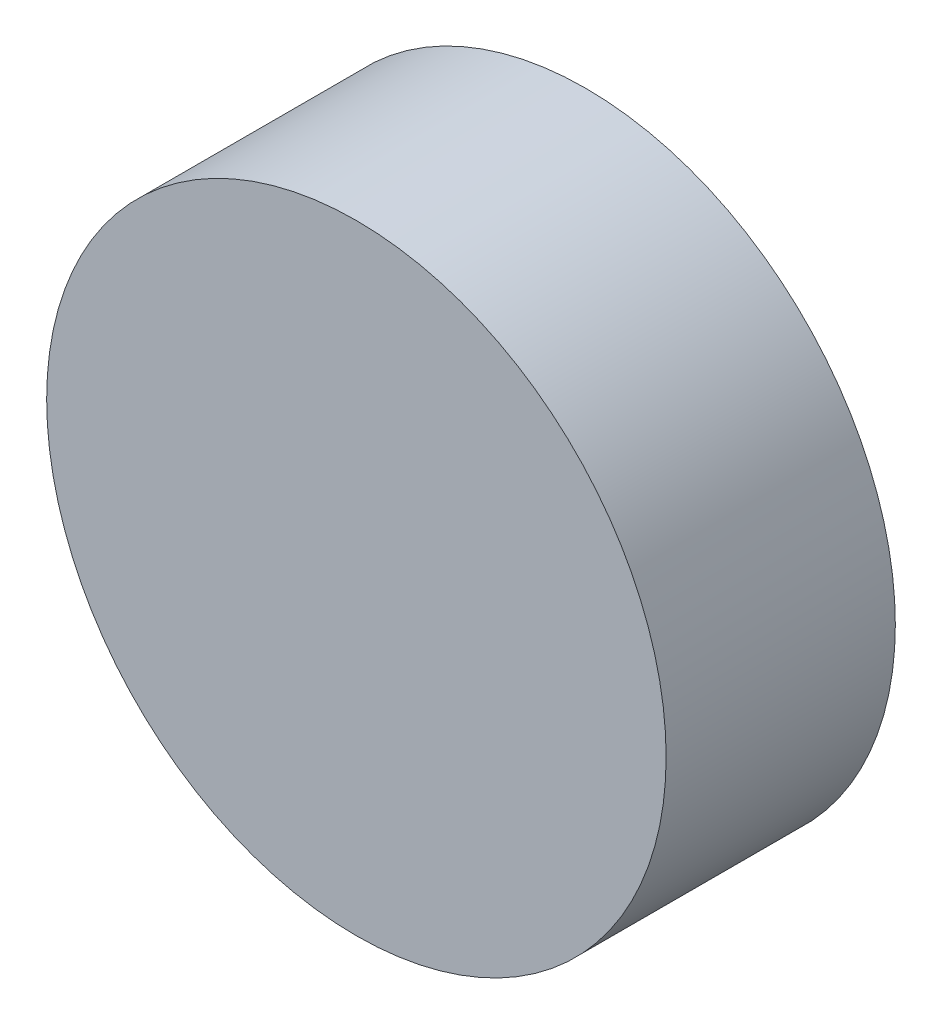
ISO-10303-21;
HEADER;
FILE_DESCRIPTION(('STEP AP214'),'2;1');
FILE_NAME('part.step','',(''),(''),'','','');
FILE_SCHEMA(('AUTOMOTIVE_DESIGN { 1 0 10303 214 1 1 1 1 }'));
ENDSEC;
DATA;
#1=APPLICATION_CONTEXT('core data for automotive mechanical design processes');
#2=APPLICATION_PROTOCOL_DEFINITION('international standard','automotive_design',2000,#1);
#3=PRODUCT_CONTEXT('',#1,'mechanical');
#4=PRODUCT('Part','Part','',(#3));
#5=PRODUCT_RELATED_PRODUCT_CATEGORY('part','',(#4));
#6=PRODUCT_DEFINITION_FORMATION('','',#4);
#7=PRODUCT_DEFINITION_CONTEXT('part definition',#1,'design');
#8=PRODUCT_DEFINITION('design','',#6,#7);
#9=PRODUCT_DEFINITION_SHAPE('','',#8);
#10=(LENGTH_UNIT() NAMED_UNIT(*) SI_UNIT(.MILLI.,.METRE.));
#11=(NAMED_UNIT(*) PLANE_ANGLE_UNIT() SI_UNIT($,.RADIAN.));
#12=(NAMED_UNIT(*) SI_UNIT($,.STERADIAN.) SOLID_ANGLE_UNIT());
#13=UNCERTAINTY_MEASURE_WITH_UNIT(LENGTH_MEASURE(1.E-05),#10,'distance_accuracy_value','');
#14=(GEOMETRIC_REPRESENTATION_CONTEXT(3) GLOBAL_UNCERTAINTY_ASSIGNED_CONTEXT((#13)) GLOBAL_UNIT_ASSIGNED_CONTEXT((#10,
#11,#12)) REPRESENTATION_CONTEXT('',''));
#15=CARTESIAN_POINT('',(0.,0.,0.));
#16=DIRECTION('',(0.,0.,1.));
#17=DIRECTION('',(1.,0.,0.));
#18=AXIS2_PLACEMENT_3D('',#15,#16,#17);
#19=CARTESIAN_POINT('',(0.,0.,1.11));
#20=DIRECTION('',(0.,0.,-1.));
#21=DIRECTION('',(-1.,0.,0.));
#22=AXIS2_PLACEMENT_3D('',#19,#20,#21);
#23=CYLINDRICAL_SURFACE('',#22,1.5);
#24=CARTESIAN_POINT('',(0.,0.,1.11));
#25=DIRECTION('',(0.,0.,1.));
#26=DIRECTION('',(1.,0.,0.));
#27=AXIS2_PLACEMENT_3D('',#24,#25,#26);
#28=CIRCLE('',#27,1.5);
#29=CARTESIAN_POINT('',(1.5,0.,1.11));
#30=VERTEX_POINT('',#29);
#31=EDGE_CURVE('E10',#30,#30,#28,.T.);
#32=ORIENTED_EDGE('',*,*,#31,.F.);
#33=EDGE_LOOP('',(#32));
#34=FACE_BOUND('',#33,.T.);
#35=CARTESIAN_POINT('',(0.,0.,0.));
#36=DIRECTION('',(0.,0.,1.));
#37=DIRECTION('',(1.,0.,0.));
#38=AXIS2_PLACEMENT_3D('',#35,#36,#37);
#39=CIRCLE('',#38,1.5);
#40=CARTESIAN_POINT('',(1.5,0.,0.));
#41=VERTEX_POINT('',#40);
#42=EDGE_CURVE('E34',#41,#41,#39,.T.);
#43=ORIENTED_EDGE('',*,*,#42,.T.);
#44=EDGE_LOOP('',(#43));
#45=FACE_BOUND('',#44,.T.);
#46=ADVANCED_FACE('F31',(#34,#45),#23,.T.);
#47=CARTESIAN_POINT('',(0.,0.,1.11));
#48=DIRECTION('',(0.,0.,1.));
#49=DIRECTION('',(1.,0.,0.));
#50=AXIS2_PLACEMENT_3D('',#47,#48,#49);
#51=PLANE('',#50);
#52=ORIENTED_EDGE('',*,*,#31,.T.);
#53=EDGE_LOOP('',(#52));
#54=FACE_BOUND('',#53,.T.);
#55=ADVANCED_FACE('F46',(#54),#51,.T.);
#56=CARTESIAN_POINT('',(0.,0.,0.));
#57=DIRECTION('',(0.,0.,1.));
#58=DIRECTION('',(1.,0.,0.));
#59=AXIS2_PLACEMENT_3D('',#56,#57,#58);
#60=PLANE('',#59);
#61=ORIENTED_EDGE('',*,*,#42,.F.);
#62=EDGE_LOOP('',(#61));
#63=FACE_BOUND('',#62,.T.);
#64=ADVANCED_FACE('F44',(#63),#60,.F.);
#65=CLOSED_SHELL('',(#46,#55,#64));
#66=MANIFOLD_SOLID_BREP('B2',#65);
#67=ADVANCED_BREP_SHAPE_REPRESENTATION('',(#18,#66),#14);
#68=SHAPE_DEFINITION_REPRESENTATION(#9,#67);
ENDSEC;
END-ISO-10303-21;
